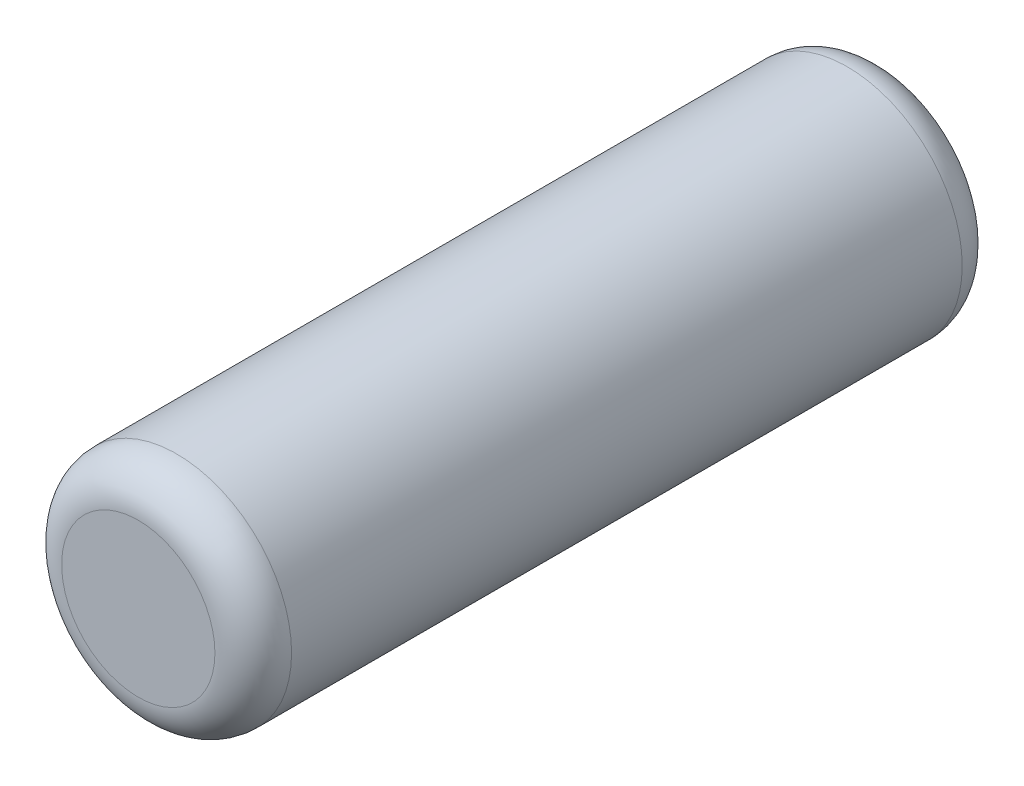
ISO-10303-21;
HEADER;
FILE_DESCRIPTION(('STEP AP214'),'2;1');
FILE_NAME('part.step','',(''),(''),'','','');
FILE_SCHEMA(('AUTOMOTIVE_DESIGN { 1 0 10303 214 1 1 1 1 }'));
ENDSEC;
DATA;
#1=APPLICATION_CONTEXT('core data for automotive mechanical design processes');
#2=APPLICATION_PROTOCOL_DEFINITION('international standard','automotive_design',2000,#1);
#3=PRODUCT_CONTEXT('',#1,'mechanical');
#4=PRODUCT('Part','Part','',(#3));
#5=PRODUCT_RELATED_PRODUCT_CATEGORY('part','',(#4));
#6=PRODUCT_DEFINITION_FORMATION('','',#4);
#7=PRODUCT_DEFINITION_CONTEXT('part definition',#1,'design');
#8=PRODUCT_DEFINITION('design','',#6,#7);
#9=PRODUCT_DEFINITION_SHAPE('','',#8);
#10=(LENGTH_UNIT() NAMED_UNIT(*) SI_UNIT(.MILLI.,.METRE.));
#11=(NAMED_UNIT(*) PLANE_ANGLE_UNIT() SI_UNIT($,.RADIAN.));
#12=(NAMED_UNIT(*) SI_UNIT($,.STERADIAN.) SOLID_ANGLE_UNIT());
#13=UNCERTAINTY_MEASURE_WITH_UNIT(LENGTH_MEASURE(1.E-05),#10,'distance_accuracy_value','');
#14=(GEOMETRIC_REPRESENTATION_CONTEXT(3) GLOBAL_UNCERTAINTY_ASSIGNED_CONTEXT((#13)) GLOBAL_UNIT_ASSIGNED_CONTEXT((#10,
#11,#12)) REPRESENTATION_CONTEXT('',''));
#15=CARTESIAN_POINT('',(0.,0.,0.));
#16=DIRECTION('',(0.,0.,1.));
#17=DIRECTION('',(1.,0.,0.));
#18=AXIS2_PLACEMENT_3D('',#15,#16,#17);
#19=CARTESIAN_POINT('',(0.,0.,19.5));
#20=DIRECTION('',(0.,0.,-1.));
#21=DIRECTION('',(-1.,0.,0.));
#22=AXIS2_PLACEMENT_3D('',#19,#20,#21);
#23=CYLINDRICAL_SURFACE('',#22,3.);
#24=CARTESIAN_POINT('',(0.,0.,1.));
#25=DIRECTION('',(0.,0.,1.));
#26=DIRECTION('',(1.,0.,0.));
#27=AXIS2_PLACEMENT_3D('',#24,#25,#26);
#28=CIRCLE('',#27,3.);
#29=CARTESIAN_POINT('',(3.,0.,1.));
#30=VERTEX_POINT('',#29);
#31=EDGE_CURVE('E42',#30,#30,#28,.T.);
#32=ORIENTED_EDGE('',*,*,#31,.T.);
#33=EDGE_LOOP('',(#32));
#34=FACE_BOUND('',#33,.T.);
#35=CARTESIAN_POINT('',(0.,0.,18.5));
#36=DIRECTION('',(0.,0.,1.));
#37=DIRECTION('',(1.,0.,0.));
#38=AXIS2_PLACEMENT_3D('',#35,#36,#37);
#39=CIRCLE('',#38,3.);
#40=CARTESIAN_POINT('',(3.,0.,18.5));
#41=VERTEX_POINT('',#40);
#42=EDGE_CURVE('E46',#41,#41,#39,.F.);
#43=ORIENTED_EDGE('',*,*,#42,.T.);
#44=EDGE_LOOP('',(#43));
#45=FACE_BOUND('',#44,.T.);
#46=ADVANCED_FACE('F31',(#34,#45),#23,.T.);
#47=CARTESIAN_POINT('',(0.,0.,19.5));
#48=DIRECTION('',(0.,0.,1.));
#49=DIRECTION('',(1.,0.,0.));
#50=AXIS2_PLACEMENT_3D('',#47,#48,#49);
#51=PLANE('',#50);
#52=CARTESIAN_POINT('',(0.,0.,19.5));
#53=DIRECTION('',(0.,0.,1.));
#54=DIRECTION('',(1.,0.,0.));
#55=AXIS2_PLACEMENT_3D('',#52,#53,#54);
#56=CIRCLE('',#55,2.);
#57=CARTESIAN_POINT('',(2.,0.,19.5));
#58=VERTEX_POINT('',#57);
#59=EDGE_CURVE('E10',#58,#58,#56,.T.);
#60=ORIENTED_EDGE('',*,*,#59,.T.);
#61=EDGE_LOOP('',(#60));
#62=FACE_BOUND('',#61,.T.);
#63=ADVANCED_FACE('F62',(#62),#51,.T.);
#64=CARTESIAN_POINT('',(0.,0.,0.));
#65=DIRECTION('',(0.,0.,1.));
#66=DIRECTION('',(1.,0.,0.));
#67=AXIS2_PLACEMENT_3D('',#64,#65,#66);
#68=PLANE('',#67);
#69=CARTESIAN_POINT('',(0.,0.,0.));
#70=DIRECTION('',(0.,0.,1.));
#71=DIRECTION('',(1.,0.,0.));
#72=AXIS2_PLACEMENT_3D('',#69,#70,#71);
#73=CIRCLE('',#72,2.);
#74=CARTESIAN_POINT('',(2.,0.,0.));
#75=VERTEX_POINT('',#74);
#76=EDGE_CURVE('E38',#75,#75,#73,.F.);
#77=ORIENTED_EDGE('',*,*,#76,.T.);
#78=EDGE_LOOP('',(#77));
#79=FACE_BOUND('',#78,.T.);
#80=ADVANCED_FACE('F59',(#79),#68,.F.);
#81=CARTESIAN_POINT('',(0.,0.,1.));
#82=DIRECTION('',(0.,0.,1.));
#83=DIRECTION('',(1.,0.,0.));
#84=AXIS2_PLACEMENT_3D('',#81,#82,#83);
#85=TOROIDAL_SURFACE('',#84,2.,1.);
#86=ORIENTED_EDGE('',*,*,#76,.F.);
#87=EDGE_LOOP('',(#86));
#88=FACE_BOUND('',#87,.T.);
#89=ORIENTED_EDGE('',*,*,#31,.F.);
#90=EDGE_LOOP('',(#89));
#91=FACE_BOUND('',#90,.T.);
#92=ADVANCED_FACE('F55',(#88,#91),#85,.T.);
#93=CARTESIAN_POINT('',(0.,0.,18.5));
#94=DIRECTION('',(0.,0.,1.));
#95=DIRECTION('',(1.,0.,0.));
#96=AXIS2_PLACEMENT_3D('',#93,#94,#95);
#97=TOROIDAL_SURFACE('',#96,2.,1.);
#98=ORIENTED_EDGE('',*,*,#42,.F.);
#99=EDGE_LOOP('',(#98));
#100=FACE_BOUND('',#99,.T.);
#101=ORIENTED_EDGE('',*,*,#59,.F.);
#102=EDGE_LOOP('',(#101));
#103=FACE_BOUND('',#102,.T.);
#104=ADVANCED_FACE('F33',(#100,#103),#97,.T.);
#105=CLOSED_SHELL('',(#46,#63,#80,#92,#104));
#106=MANIFOLD_SOLID_BREP('B2',#105);
#107=ADVANCED_BREP_SHAPE_REPRESENTATION('',(#18,#106),#14);
#108=SHAPE_DEFINITION_REPRESENTATION(#9,#107);
ENDSEC;
END-ISO-10303-21;
